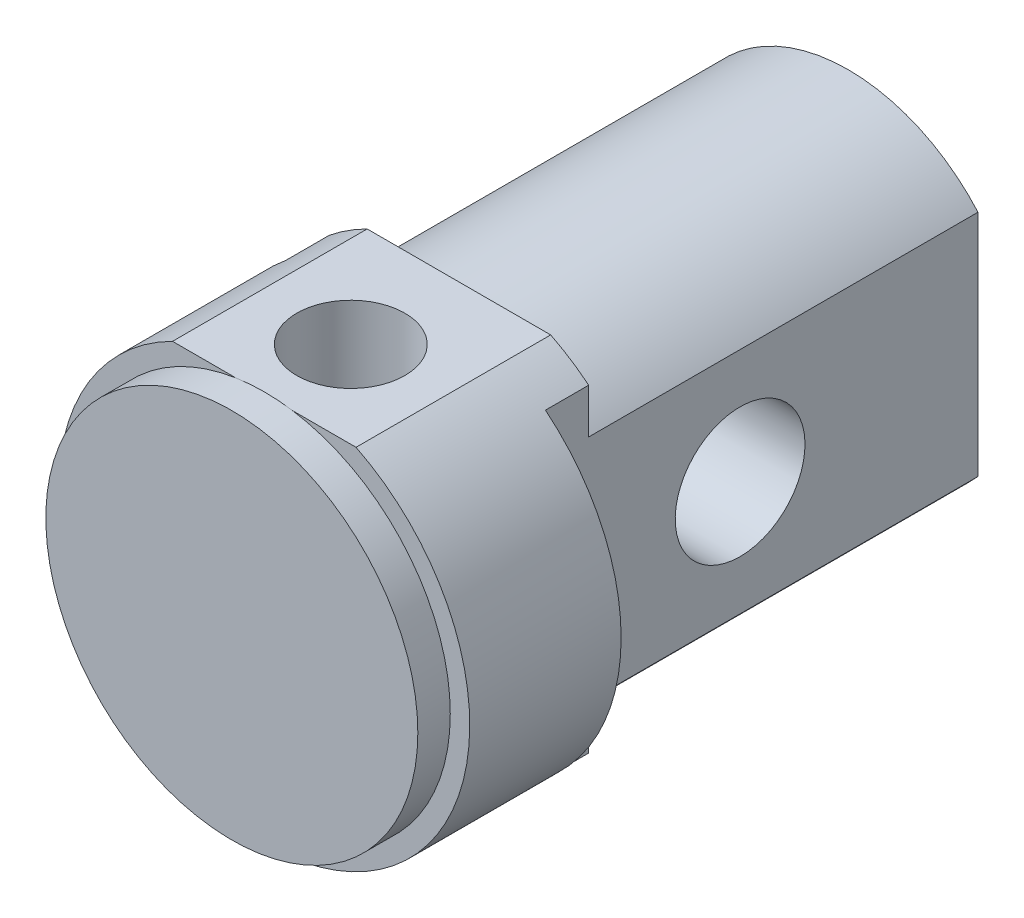
ISO-10303-21;
HEADER;
FILE_DESCRIPTION(('STEP AP214'),'2;1');
FILE_NAME('part.step','',(''),(''),'','','');
FILE_SCHEMA(('AUTOMOTIVE_DESIGN { 1 0 10303 214 1 1 1 1 }'));
ENDSEC;
DATA;
#1=APPLICATION_CONTEXT('core data for automotive mechanical design processes');
#2=APPLICATION_PROTOCOL_DEFINITION('international standard','automotive_design',2000,#1);
#3=PRODUCT_CONTEXT('',#1,'mechanical');
#4=PRODUCT('Part','Part','',(#3));
#5=PRODUCT_RELATED_PRODUCT_CATEGORY('part','',(#4));
#6=PRODUCT_DEFINITION_FORMATION('','',#4);
#7=PRODUCT_DEFINITION_CONTEXT('part definition',#1,'design');
#8=PRODUCT_DEFINITION('design','',#6,#7);
#9=PRODUCT_DEFINITION_SHAPE('','',#8);
#10=(LENGTH_UNIT() NAMED_UNIT(*) SI_UNIT(.MILLI.,.METRE.));
#11=(NAMED_UNIT(*) PLANE_ANGLE_UNIT() SI_UNIT($,.RADIAN.));
#12=(NAMED_UNIT(*) SI_UNIT($,.STERADIAN.) SOLID_ANGLE_UNIT());
#13=UNCERTAINTY_MEASURE_WITH_UNIT(LENGTH_MEASURE(1.E-05),#10,'distance_accuracy_value','');
#14=(GEOMETRIC_REPRESENTATION_CONTEXT(3) GLOBAL_UNCERTAINTY_ASSIGNED_CONTEXT((#13)) GLOBAL_UNIT_ASSIGNED_CONTEXT((#10,
#11,#12)) REPRESENTATION_CONTEXT('',''));
#15=CARTESIAN_POINT('',(0.,0.,0.));
#16=DIRECTION('',(0.,0.,1.));
#17=DIRECTION('',(1.,0.,0.));
#18=AXIS2_PLACEMENT_3D('',#15,#16,#17);
#19=CARTESIAN_POINT('',(0.,0.,10.5));
#20=DIRECTION('',(0.,0.,-1.));
#21=DIRECTION('',(-1.,0.,0.));
#22=AXIS2_PLACEMENT_3D('',#19,#20,#21);
#23=PLANE('',#22);
#24=CARTESIAN_POINT('',(0.,0.,10.5));
#25=DIRECTION('',(0.,0.,1.));
#26=DIRECTION('',(1.,0.,0.));
#27=AXIS2_PLACEMENT_3D('',#24,#25,#26);
#28=CIRCLE('',#27,8.6);
#29=CARTESIAN_POINT('',(8.6,0.,10.5));
#30=VERTEX_POINT('',#29);
#31=EDGE_CURVE('E20',#30,#30,#28,.F.);
#32=ORIENTED_EDGE('',*,*,#31,.F.);
#33=EDGE_LOOP('',(#32));
#34=FACE_BOUND('',#33,.T.);
#35=ADVANCED_FACE('F16',(#34),#23,.F.);
#36=CARTESIAN_POINT('',(-2.55,4.5,2.45));
#37=DIRECTION('',(0.,-1.,0.));
#38=DIRECTION('',(1.,0.,0.));
#39=AXIS2_PLACEMENT_3D('',#36,#37,#38);
#40=PLANE('',#39);
#41=CARTESIAN_POINT('',(0.,4.5,5.));
#42=DIRECTION('',(0.,-1.,0.));
#43=DIRECTION('',(1.,0.,0.));
#44=AXIS2_PLACEMENT_3D('',#41,#42,#43);
#45=CIRCLE('',#44,2.5);
#46=CARTESIAN_POINT('',(2.5,4.5,5.));
#47=VERTEX_POINT('',#46);
#48=EDGE_CURVE('E121',#47,#47,#45,.F.);
#49=ORIENTED_EDGE('',*,*,#48,.T.);
#50=EDGE_LOOP('',(#49));
#51=FACE_BOUND('',#50,.T.);
#52=ADVANCED_FACE('F173',(#51),#40,.F.);
#53=CARTESIAN_POINT('',(0.,0.,9.));
#54=DIRECTION('',(0.,0.,1.));
#55=DIRECTION('',(1.,0.,0.));
#56=AXIS2_PLACEMENT_3D('',#53,#54,#55);
#57=CYLINDRICAL_SURFACE('',#56,8.6);
#58=CARTESIAN_POINT('',(0.,0.,9.));
#59=DIRECTION('',(0.,0.,1.));
#60=DIRECTION('',(1.,0.,0.));
#61=AXIS2_PLACEMENT_3D('',#58,#59,#60);
#62=CIRCLE('',#61,8.6);
#63=CARTESIAN_POINT('',(-1.30766968306222,8.5,9.));
#64=VERTEX_POINT('',#63);
#65=CARTESIAN_POINT('',(1.30766968306221,8.5,9.));
#66=VERTEX_POINT('',#65);
#67=EDGE_CURVE('E100',#64,#66,#62,.T.);
#68=ORIENTED_EDGE('',*,*,#67,.T.);
#69=CARTESIAN_POINT('',(0.,0.,9.));
#70=DIRECTION('',(0.,0.,1.));
#71=DIRECTION('',(1.,0.,0.));
#72=AXIS2_PLACEMENT_3D('',#69,#70,#71);
#73=CIRCLE('',#72,8.6);
#74=EDGE_CURVE('E97',#64,#66,#73,.F.);
#75=ORIENTED_EDGE('',*,*,#74,.F.);
#76=EDGE_LOOP('',(#68,#75));
#77=FACE_BOUND('',#76,.T.);
#78=ORIENTED_EDGE('',*,*,#31,.T.);
#79=EDGE_LOOP('',(#78));
#80=FACE_BOUND('',#79,.T.);
#81=ADVANCED_FACE('F102',(#77,#80),#57,.T.);
#82=CARTESIAN_POINT('',(0.,0.,9.));
#83=DIRECTION('',(0.,0.,-1.));
#84=DIRECTION('',(-1.,0.,0.));
#85=AXIS2_PLACEMENT_3D('',#82,#83,#84);
#86=PLANE('',#85);
#87=DIRECTION('',(1.,0.,0.));
#88=VECTOR('',#87,1.);
#89=CARTESIAN_POINT('',(-4.2426406871193,8.5,9.));
#90=LINE('',#89,#88);
#91=EDGE_CURVE('E117',#66,#64,#90,.F.);
#92=ORIENTED_EDGE('',*,*,#91,.T.);
#93=ORIENTED_EDGE('',*,*,#74,.T.);
#94=EDGE_LOOP('',(#92,#93));
#95=FACE_BOUND('',#94,.T.);
#96=ADVANCED_FACE('F120',(#95),#86,.T.);
#97=CARTESIAN_POINT('',(0.,8.5,5.));
#98=DIRECTION('',(0.,-1.,0.));
#99=DIRECTION('',(1.,0.,0.));
#100=AXIS2_PLACEMENT_3D('',#97,#98,#99);
#101=CYLINDRICAL_SURFACE('',#100,2.5);
#102=ORIENTED_EDGE('',*,*,#48,.F.);
#103=EDGE_LOOP('',(#102));
#104=FACE_BOUND('',#103,.T.);
#105=CARTESIAN_POINT('',(0.,8.49999999999999,5.));
#106=DIRECTION('',(0.,-1.,0.));
#107=DIRECTION('',(1.,0.,0.));
#108=AXIS2_PLACEMENT_3D('',#105,#106,#107);
#109=CIRCLE('',#108,2.5);
#110=CARTESIAN_POINT('',(2.5,8.5,5.));
#111=VERTEX_POINT('',#110);
#112=EDGE_CURVE('E126',#111,#111,#109,.F.);
#113=ORIENTED_EDGE('',*,*,#112,.T.);
#114=EDGE_LOOP('',(#113));
#115=FACE_BOUND('',#114,.T.);
#116=ADVANCED_FACE('F175',(#104,#115),#101,.F.);
#117=CARTESIAN_POINT('',(0.,0.,0.));
#118=DIRECTION('',(0.,0.,-1.));
#119=DIRECTION('',(-1.,0.,0.));
#120=AXIS2_PLACEMENT_3D('',#117,#118,#119);
#121=CYLINDRICAL_SURFACE('',#120,8.);
#122=DIRECTION('',(0.,0.,-1.));
#123=VECTOR('',#122,1.);
#124=CARTESIAN_POINT('',(-6.,5.29150262212918,-18.));
#125=LINE('',#124,#123);
#126=CARTESIAN_POINT('',(-6.,5.29150262212918,-18.));
#127=VERTEX_POINT('',#126);
#128=CARTESIAN_POINT('',(-6.,5.29150262212918,0.));
#129=VERTEX_POINT('',#128);
#130=EDGE_CURVE('E129',#127,#129,#125,.F.);
#131=ORIENTED_EDGE('',*,*,#130,.T.);
#132=CARTESIAN_POINT('',(0.,0.,0.));
#133=DIRECTION('',(0.,0.,-1.));
#134=DIRECTION('',(-1.,0.,0.));
#135=AXIS2_PLACEMENT_3D('',#132,#133,#134);
#136=CIRCLE('',#135,8.);
#137=CARTESIAN_POINT('',(5.99999999999999,5.29150262212919,0.));
#138=VERTEX_POINT('',#137);
#139=EDGE_CURVE('E161',#138,#129,#136,.F.);
#140=ORIENTED_EDGE('',*,*,#139,.F.);
#141=DIRECTION('',(0.,0.,1.));
#142=VECTOR('',#141,1.);
#143=CARTESIAN_POINT('',(5.99999999999999,5.29150262212919,-18.));
#144=LINE('',#143,#142);
#145=CARTESIAN_POINT('',(5.99999999999999,5.29150262212919,-18.));
#146=VERTEX_POINT('',#145);
#147=EDGE_CURVE('E256',#138,#146,#144,.F.);
#148=ORIENTED_EDGE('',*,*,#147,.T.);
#149=CARTESIAN_POINT('',(0.,0.,-18.));
#150=DIRECTION('',(0.,0.,-1.));
#151=DIRECTION('',(-1.,0.,0.));
#152=AXIS2_PLACEMENT_3D('',#149,#150,#151);
#153=CIRCLE('',#152,8.);
#154=EDGE_CURVE('E168',#146,#127,#153,.F.);
#155=ORIENTED_EDGE('',*,*,#154,.T.);
#156=EDGE_LOOP('',(#131,#140,#148,#155));
#157=FACE_BOUND('',#156,.T.);
#158=ADVANCED_FACE('F178',(#157),#121,.T.);
#159=CARTESIAN_POINT('',(0.,0.,-18.));
#160=DIRECTION('',(0.,0.,1.));
#161=DIRECTION('',(1.,0.,0.));
#162=AXIS2_PLACEMENT_3D('',#159,#160,#161);
#163=PLANE('',#162);
#164=CARTESIAN_POINT('',(0.,0.,-18.));
#165=DIRECTION('',(0.,0.,-1.));
#166=DIRECTION('',(-1.,0.,0.));
#167=AXIS2_PLACEMENT_3D('',#164,#165,#166);
#168=CIRCLE('',#167,8.);
#169=CARTESIAN_POINT('',(-6.,-5.29150262212919,-18.));
#170=VERTEX_POINT('',#169);
#171=CARTESIAN_POINT('',(5.99999999999999,-5.2915026221292,-18.));
#172=VERTEX_POINT('',#171);
#173=EDGE_CURVE('E107',#170,#172,#168,.F.);
#174=ORIENTED_EDGE('',*,*,#173,.F.);
#175=DIRECTION('',(0.,1.,0.));
#176=VECTOR('',#175,1.);
#177=CARTESIAN_POINT('',(-6.,5.29150262212919,-18.));
#178=LINE('',#177,#176);
#179=EDGE_CURVE('E243',#170,#127,#178,.T.);
#180=ORIENTED_EDGE('',*,*,#179,.T.);
#181=ORIENTED_EDGE('',*,*,#154,.F.);
#182=DIRECTION('',(0.,1.,0.));
#183=VECTOR('',#182,1.);
#184=CARTESIAN_POINT('',(5.99999999999999,-5.29150262212919,-18.));
#185=LINE('',#184,#183);
#186=EDGE_CURVE('E254',#146,#172,#185,.F.);
#187=ORIENTED_EDGE('',*,*,#186,.T.);
#188=EDGE_LOOP('',(#174,#180,#181,#187));
#189=FACE_BOUND('',#188,.T.);
#190=ADVANCED_FACE('F223',(#189),#163,.F.);
#191=CARTESIAN_POINT('',(0.,0.,0.));
#192=DIRECTION('',(0.,0.,-1.));
#193=DIRECTION('',(-1.,0.,0.));
#194=AXIS2_PLACEMENT_3D('',#191,#192,#193);
#195=CYLINDRICAL_SURFACE('',#194,8.);
#196=DIRECTION('',(0.,0.,-1.));
#197=VECTOR('',#196,1.);
#198=CARTESIAN_POINT('',(-6.,-5.2915026221292,-18.));
#199=LINE('',#198,#197);
#200=CARTESIAN_POINT('',(-5.99999999999999,-5.29150262212919,0.));
#201=VERTEX_POINT('',#200);
#202=EDGE_CURVE('E237',#201,#170,#199,.T.);
#203=ORIENTED_EDGE('',*,*,#202,.T.);
#204=ORIENTED_EDGE('',*,*,#173,.T.);
#205=DIRECTION('',(0.,0.,1.));
#206=VECTOR('',#205,1.);
#207=CARTESIAN_POINT('',(5.99999999999999,-5.2915026221292,-18.));
#208=LINE('',#207,#206);
#209=CARTESIAN_POINT('',(5.99999999999999,-5.2915026221292,0.));
#210=VERTEX_POINT('',#209);
#211=EDGE_CURVE('E153',#172,#210,#208,.T.);
#212=ORIENTED_EDGE('',*,*,#211,.T.);
#213=CARTESIAN_POINT('',(0.,0.,0.));
#214=DIRECTION('',(0.,0.,-1.));
#215=DIRECTION('',(-1.,0.,0.));
#216=AXIS2_PLACEMENT_3D('',#213,#214,#215);
#217=CIRCLE('',#216,8.);
#218=EDGE_CURVE('E154',#201,#210,#217,.F.);
#219=ORIENTED_EDGE('',*,*,#218,.F.);
#220=EDGE_LOOP('',(#203,#204,#212,#219));
#221=FACE_BOUND('',#220,.T.);
#222=ADVANCED_FACE('F227',(#221),#195,.T.);
#223=CARTESIAN_POINT('',(6.,0.,-7.));
#224=DIRECTION('',(-1.,0.,0.));
#225=DIRECTION('',(0.,-1.,0.));
#226=AXIS2_PLACEMENT_3D('',#223,#224,#225);
#227=CYLINDRICAL_SURFACE('',#226,3.);
#228=CARTESIAN_POINT('',(5.99999999999999,0.,-7.));
#229=DIRECTION('',(-1.,0.,0.));
#230=DIRECTION('',(0.,-1.,0.));
#231=AXIS2_PLACEMENT_3D('',#228,#229,#230);
#232=CIRCLE('',#231,3.);
#233=CARTESIAN_POINT('',(5.99999999999999,-3.00000000000001,-7.));
#234=VERTEX_POINT('',#233);
#235=EDGE_CURVE('E150',#234,#234,#232,.F.);
#236=ORIENTED_EDGE('',*,*,#235,.T.);
#237=EDGE_LOOP('',(#236));
#238=FACE_BOUND('',#237,.T.);
#239=CARTESIAN_POINT('',(-6.,0.,-7.));
#240=DIRECTION('',(-1.,0.,0.));
#241=DIRECTION('',(0.,-1.,0.));
#242=AXIS2_PLACEMENT_3D('',#239,#240,#241);
#243=CIRCLE('',#242,3.);
#244=CARTESIAN_POINT('',(-6.,-3.,-7.));
#245=VERTEX_POINT('',#244);
#246=EDGE_CURVE('E158',#245,#245,#243,.T.);
#247=ORIENTED_EDGE('',*,*,#246,.T.);
#248=EDGE_LOOP('',(#247));
#249=FACE_BOUND('',#248,.T.);
#250=ADVANCED_FACE('F18',(#238,#249),#227,.F.);
#251=CARTESIAN_POINT('',(0.,0.,9.));
#252=DIRECTION('',(0.,0.,-1.));
#253=DIRECTION('',(-1.,0.,0.));
#254=AXIS2_PLACEMENT_3D('',#251,#252,#253);
#255=PLANE('',#254);
#256=DIRECTION('',(1.,0.,0.));
#257=VECTOR('',#256,1.);
#258=CARTESIAN_POINT('',(-4.2426406871193,8.5,9.));
#259=LINE('',#258,#257);
#260=CARTESIAN_POINT('',(-4.24264068711929,8.5,9.));
#261=VERTEX_POINT('',#260);
#262=EDGE_CURVE('E124',#64,#261,#259,.F.);
#263=ORIENTED_EDGE('',*,*,#262,.T.);
#264=CARTESIAN_POINT('',(0.,0.,9.));
#265=DIRECTION('',(0.,0.,1.));
#266=DIRECTION('',(1.,0.,0.));
#267=AXIS2_PLACEMENT_3D('',#264,#265,#266);
#268=CIRCLE('',#267,9.5);
#269=CARTESIAN_POINT('',(4.24264068711928,8.5,9.));
#270=VERTEX_POINT('',#269);
#271=EDGE_CURVE('E112',#270,#261,#268,.F.);
#272=ORIENTED_EDGE('',*,*,#271,.F.);
#273=DIRECTION('',(1.,0.,0.));
#274=VECTOR('',#273,1.);
#275=CARTESIAN_POINT('',(-4.2426406871193,8.5,9.));
#276=LINE('',#275,#274);
#277=EDGE_CURVE('E106',#270,#66,#276,.F.);
#278=ORIENTED_EDGE('',*,*,#277,.T.);
#279=ORIENTED_EDGE('',*,*,#67,.F.);
#280=EDGE_LOOP('',(#263,#272,#278,#279));
#281=FACE_BOUND('',#280,.T.);
#282=ADVANCED_FACE('F110',(#281),#255,.F.);
#283=CARTESIAN_POINT('',(-4.2426406871193,8.5,9.));
#284=DIRECTION('',(0.,-1.,0.));
#285=DIRECTION('',(0.,0.,-1.));
#286=AXIS2_PLACEMENT_3D('',#283,#284,#285);
#287=PLANE('',#286);
#288=ORIENTED_EDGE('',*,*,#112,.F.);
#289=EDGE_LOOP('',(#288));
#290=FACE_BOUND('',#289,.T.);
#291=DIRECTION('',(0.,0.,1.));
#292=VECTOR('',#291,1.);
#293=CARTESIAN_POINT('',(-4.24264068711929,8.5,0.));
#294=LINE('',#293,#292);
#295=CARTESIAN_POINT('',(-4.24264068711929,8.5,0.));
#296=VERTEX_POINT('',#295);
#297=EDGE_CURVE('E143',#261,#296,#294,.F.);
#298=ORIENTED_EDGE('',*,*,#297,.F.);
#299=ORIENTED_EDGE('',*,*,#262,.F.);
#300=ORIENTED_EDGE('',*,*,#91,.F.);
#301=ORIENTED_EDGE('',*,*,#277,.F.);
#302=DIRECTION('',(0.,0.,1.));
#303=VECTOR('',#302,1.);
#304=CARTESIAN_POINT('',(4.24264068711928,8.5,0.));
#305=LINE('',#304,#303);
#306=CARTESIAN_POINT('',(4.24264068711928,8.5,0.));
#307=VERTEX_POINT('',#306);
#308=EDGE_CURVE('E145',#307,#270,#305,.T.);
#309=ORIENTED_EDGE('',*,*,#308,.F.);
#310=DIRECTION('',(-1.,0.,0.));
#311=VECTOR('',#310,1.);
#312=CARTESIAN_POINT('',(0.,8.5,0.));
#313=LINE('',#312,#311);
#314=EDGE_CURVE('E163',#296,#307,#313,.F.);
#315=ORIENTED_EDGE('',*,*,#314,.F.);
#316=EDGE_LOOP('',(#298,#299,#300,#301,#309,#315));
#317=FACE_BOUND('',#316,.T.);
#318=ADVANCED_FACE('F123',(#290,#317),#287,.F.);
#319=CARTESIAN_POINT('',(0.,0.,0.));
#320=DIRECTION('',(0.,0.,-1.));
#321=DIRECTION('',(-1.,0.,0.));
#322=AXIS2_PLACEMENT_3D('',#319,#320,#321);
#323=PLANE('',#322);
#324=ORIENTED_EDGE('',*,*,#314,.T.);
#325=CARTESIAN_POINT('',(0.,0.,0.));
#326=DIRECTION('',(0.,0.,1.));
#327=DIRECTION('',(1.,0.,0.));
#328=AXIS2_PLACEMENT_3D('',#325,#326,#327);
#329=CIRCLE('',#328,9.5);
#330=CARTESIAN_POINT('',(5.99999999999999,7.36545993132813,0.));
#331=VERTEX_POINT('',#330);
#332=EDGE_CURVE('E146',#331,#307,#329,.T.);
#333=ORIENTED_EDGE('',*,*,#332,.F.);
#334=DIRECTION('',(0.,1.,0.));
#335=VECTOR('',#334,1.);
#336=CARTESIAN_POINT('',(5.99999999999999,-5.29150262212919,0.));
#337=LINE('',#336,#335);
#338=EDGE_CURVE('E258',#331,#138,#337,.F.);
#339=ORIENTED_EDGE('',*,*,#338,.T.);
#340=ORIENTED_EDGE('',*,*,#139,.T.);
#341=DIRECTION('',(0.,1.,0.));
#342=VECTOR('',#341,1.);
#343=CARTESIAN_POINT('',(-6.,5.29150262212919,0.));
#344=LINE('',#343,#342);
#345=CARTESIAN_POINT('',(-5.99999999999999,7.36545993132812,0.));
#346=VERTEX_POINT('',#345);
#347=EDGE_CURVE('E264',#129,#346,#344,.T.);
#348=ORIENTED_EDGE('',*,*,#347,.T.);
#349=CARTESIAN_POINT('',(0.,0.,0.));
#350=DIRECTION('',(0.,0.,1.));
#351=DIRECTION('',(1.,0.,0.));
#352=AXIS2_PLACEMENT_3D('',#349,#350,#351);
#353=CIRCLE('',#352,9.5);
#354=EDGE_CURVE('E140',#296,#346,#353,.T.);
#355=ORIENTED_EDGE('',*,*,#354,.F.);
#356=EDGE_LOOP('',(#324,#333,#339,#340,#348,#355));
#357=FACE_BOUND('',#356,.T.);
#358=ADVANCED_FACE('F182',(#357),#323,.T.);
#359=CARTESIAN_POINT('',(-6.62123163458704,0.,2.));
#360=DIRECTION('',(0.,0.,1.));
#361=DIRECTION('',(1.,0.,0.));
#362=AXIS2_PLACEMENT_3D('',#359,#360,#361);
#363=PLANE('',#362);
#364=CARTESIAN_POINT('',(0.,0.,1.99999999999999));
#365=DIRECTION('',(0.,0.,1.));
#366=DIRECTION('',(1.,0.,0.));
#367=AXIS2_PLACEMENT_3D('',#364,#365,#366);
#368=CIRCLE('',#367,9.5);
#369=CARTESIAN_POINT('',(-5.99999999999999,7.36545993132812,1.99999999999999));
#370=VERTEX_POINT('',#369);
#371=CARTESIAN_POINT('',(-5.99999999999999,-7.36545993132812,1.99999999999999));
#372=VERTEX_POINT('',#371);
#373=EDGE_CURVE('E136',#370,#372,#368,.T.);
#374=ORIENTED_EDGE('',*,*,#373,.F.);
#375=DIRECTION('',(0.,1.,0.));
#376=VECTOR('',#375,1.);
#377=CARTESIAN_POINT('',(-6.,5.29150262212919,1.99999999999999));
#378=LINE('',#377,#376);
#379=EDGE_CURVE('E244',#370,#372,#378,.F.);
#380=ORIENTED_EDGE('',*,*,#379,.T.);
#381=EDGE_LOOP('',(#374,#380));
#382=FACE_BOUND('',#381,.T.);
#383=ADVANCED_FACE('F189',(#382),#363,.F.);
#384=CARTESIAN_POINT('',(-6.,5.29150262212919,-18.));
#385=DIRECTION('',(1.,0.,0.));
#386=DIRECTION('',(0.,0.,-1.));
#387=AXIS2_PLACEMENT_3D('',#384,#385,#386);
#388=PLANE('',#387);
#389=ORIENTED_EDGE('',*,*,#246,.F.);
#390=EDGE_LOOP('',(#389));
#391=FACE_BOUND('',#390,.T.);
#392=ORIENTED_EDGE('',*,*,#179,.F.);
#393=ORIENTED_EDGE('',*,*,#202,.F.);
#394=DIRECTION('',(0.,1.,0.));
#395=VECTOR('',#394,1.);
#396=CARTESIAN_POINT('',(-5.99999999999999,0.,0.));
#397=LINE('',#396,#395);
#398=CARTESIAN_POINT('',(-5.99999999999999,-7.36545993132813,0.));
#399=VERTEX_POINT('',#398);
#400=EDGE_CURVE('E157',#399,#201,#397,.T.);
#401=ORIENTED_EDGE('',*,*,#400,.F.);
#402=DIRECTION('',(0.,0.,1.));
#403=VECTOR('',#402,1.);
#404=CARTESIAN_POINT('',(-5.99999999999999,-7.36545993132813,0.));
#405=LINE('',#404,#403);
#406=EDGE_CURVE('E135',#372,#399,#405,.F.);
#407=ORIENTED_EDGE('',*,*,#406,.F.);
#408=ORIENTED_EDGE('',*,*,#379,.F.);
#409=DIRECTION('',(0.,0.,1.));
#410=VECTOR('',#409,1.);
#411=CARTESIAN_POINT('',(-5.99999999999999,7.36545993132812,0.));
#412=LINE('',#411,#410);
#413=EDGE_CURVE('E139',#346,#370,#412,.T.);
#414=ORIENTED_EDGE('',*,*,#413,.F.);
#415=ORIENTED_EDGE('',*,*,#347,.F.);
#416=ORIENTED_EDGE('',*,*,#130,.F.);
#417=EDGE_LOOP('',(#392,#393,#401,#407,#408,#414,#415,#416));
#418=FACE_BOUND('',#417,.T.);
#419=ADVANCED_FACE('F248',(#391,#418),#388,.F.);
#420=CARTESIAN_POINT('',(0.,0.,0.));
#421=DIRECTION('',(0.,0.,-1.));
#422=DIRECTION('',(-1.,0.,0.));
#423=AXIS2_PLACEMENT_3D('',#420,#421,#422);
#424=PLANE('',#423);
#425=ORIENTED_EDGE('',*,*,#400,.T.);
#426=ORIENTED_EDGE('',*,*,#218,.T.);
#427=DIRECTION('',(0.,1.,0.));
#428=VECTOR('',#427,1.);
#429=CARTESIAN_POINT('',(5.99999999999999,-5.29150262212919,0.));
#430=LINE('',#429,#428);
#431=CARTESIAN_POINT('',(5.99999999999999,-7.36545993132813,0.));
#432=VERTEX_POINT('',#431);
#433=EDGE_CURVE('E156',#210,#432,#430,.F.);
#434=ORIENTED_EDGE('',*,*,#433,.T.);
#435=CARTESIAN_POINT('',(0.,0.,0.));
#436=DIRECTION('',(0.,0.,1.));
#437=DIRECTION('',(1.,0.,0.));
#438=AXIS2_PLACEMENT_3D('',#435,#436,#437);
#439=CIRCLE('',#438,9.5);
#440=EDGE_CURVE('E132',#399,#432,#439,.T.);
#441=ORIENTED_EDGE('',*,*,#440,.F.);
#442=EDGE_LOOP('',(#425,#426,#434,#441));
#443=FACE_BOUND('',#442,.T.);
#444=ADVANCED_FACE('F284',(#443),#424,.T.);
#445=CARTESIAN_POINT('',(5.99999999999999,-5.29150262212919,-18.));
#446=DIRECTION('',(-1.,0.,0.));
#447=DIRECTION('',(0.,0.,1.));
#448=AXIS2_PLACEMENT_3D('',#445,#446,#447);
#449=PLANE('',#448);
#450=ORIENTED_EDGE('',*,*,#235,.F.);
#451=EDGE_LOOP('',(#450));
#452=FACE_BOUND('',#451,.T.);
#453=ORIENTED_EDGE('',*,*,#186,.F.);
#454=ORIENTED_EDGE('',*,*,#147,.F.);
#455=ORIENTED_EDGE('',*,*,#338,.F.);
#456=DIRECTION('',(0.,0.,1.));
#457=VECTOR('',#456,1.);
#458=CARTESIAN_POINT('',(5.99999999999999,7.36545993132813,0.));
#459=LINE('',#458,#457);
#460=CARTESIAN_POINT('',(5.99999999999999,7.36545993132812,2.));
#461=VERTEX_POINT('',#460);
#462=EDGE_CURVE('E149',#461,#331,#459,.F.);
#463=ORIENTED_EDGE('',*,*,#462,.F.);
#464=DIRECTION('',(0.,1.,0.));
#465=VECTOR('',#464,1.);
#466=CARTESIAN_POINT('',(6.,0.,2.));
#467=LINE('',#466,#465);
#468=CARTESIAN_POINT('',(5.99999999999999,-7.36545993132813,2.));
#469=VERTEX_POINT('',#468);
#470=EDGE_CURVE('E35',#461,#469,#467,.F.);
#471=ORIENTED_EDGE('',*,*,#470,.T.);
#472=DIRECTION('',(0.,0.,1.));
#473=VECTOR('',#472,1.);
#474=CARTESIAN_POINT('',(5.99999999999998,-7.36545993132813,0.));
#475=LINE('',#474,#473);
#476=EDGE_CURVE('E26',#432,#469,#475,.T.);
#477=ORIENTED_EDGE('',*,*,#476,.F.);
#478=ORIENTED_EDGE('',*,*,#433,.F.);
#479=ORIENTED_EDGE('',*,*,#211,.F.);
#480=EDGE_LOOP('',(#453,#454,#455,#463,#471,#477,#478,#479));
#481=FACE_BOUND('',#480,.T.);
#482=ADVANCED_FACE('F201',(#452,#481),#449,.F.);
#483=CARTESIAN_POINT('',(6.62123163458703,0.,2.));
#484=DIRECTION('',(0.,0.,1.));
#485=DIRECTION('',(1.,0.,0.));
#486=AXIS2_PLACEMENT_3D('',#483,#484,#485);
#487=PLANE('',#486);
#488=CARTESIAN_POINT('',(0.,0.,2.));
#489=DIRECTION('',(0.,0.,1.));
#490=DIRECTION('',(1.,0.,0.));
#491=AXIS2_PLACEMENT_3D('',#488,#489,#490);
#492=CIRCLE('',#491,9.5);
#493=EDGE_CURVE('E11',#469,#461,#492,.T.);
#494=ORIENTED_EDGE('',*,*,#493,.F.);
#495=ORIENTED_EDGE('',*,*,#470,.F.);
#496=EDGE_LOOP('',(#494,#495));
#497=FACE_BOUND('',#496,.T.);
#498=ADVANCED_FACE('F195',(#497),#487,.F.);
#499=CARTESIAN_POINT('',(0.,0.,0.));
#500=DIRECTION('',(0.,0.,1.));
#501=DIRECTION('',(1.,0.,0.));
#502=AXIS2_PLACEMENT_3D('',#499,#500,#501);
#503=CYLINDRICAL_SURFACE('',#502,9.5);
#504=ORIENTED_EDGE('',*,*,#476,.T.);
#505=ORIENTED_EDGE('',*,*,#493,.T.);
#506=ORIENTED_EDGE('',*,*,#462,.T.);
#507=ORIENTED_EDGE('',*,*,#332,.T.);
#508=ORIENTED_EDGE('',*,*,#308,.T.);
#509=ORIENTED_EDGE('',*,*,#271,.T.);
#510=ORIENTED_EDGE('',*,*,#297,.T.);
#511=ORIENTED_EDGE('',*,*,#354,.T.);
#512=ORIENTED_EDGE('',*,*,#413,.T.);
#513=ORIENTED_EDGE('',*,*,#373,.T.);
#514=ORIENTED_EDGE('',*,*,#406,.T.);
#515=ORIENTED_EDGE('',*,*,#440,.T.);
#516=EDGE_LOOP('',(#504,#505,#506,#507,#508,#509,#510,#511,#512,#513,#514,#515));
#517=FACE_BOUND('',#516,.T.);
#518=ADVANCED_FACE('F193',(#517),#503,.T.);
#519=CLOSED_SHELL('',(#35,#52,#81,#96,#116,#158,#190,#222,#250,#282,#318,#358,#383,#419,#444,
#482,#498,#518));
#520=MANIFOLD_SOLID_BREP('B1',#519);
#521=ADVANCED_BREP_SHAPE_REPRESENTATION('',(#18,#520),#14);
#522=SHAPE_DEFINITION_REPRESENTATION(#9,#521);
ENDSEC;
END-ISO-10303-21;
